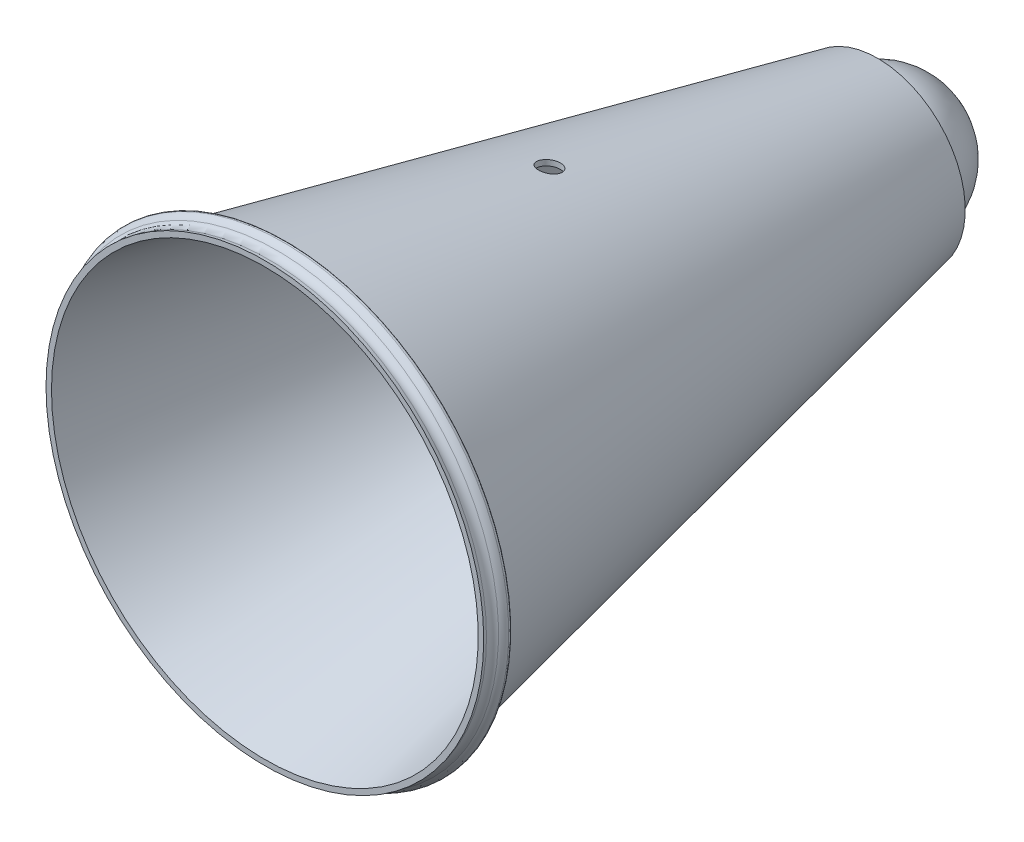
ISO-10303-21;
HEADER;
FILE_DESCRIPTION(('STEP AP214'),'2;1');
FILE_NAME('part.step','',(''),(''),'','','');
FILE_SCHEMA(('AUTOMOTIVE_DESIGN { 1 0 10303 214 1 1 1 1 }'));
ENDSEC;
DATA;
#1=APPLICATION_CONTEXT('core data for automotive mechanical design processes');
#2=APPLICATION_PROTOCOL_DEFINITION('international standard','automotive_design',2000,#1);
#3=PRODUCT_CONTEXT('',#1,'mechanical');
#4=PRODUCT('Part','Part','',(#3));
#5=PRODUCT_RELATED_PRODUCT_CATEGORY('part','',(#4));
#6=PRODUCT_DEFINITION_FORMATION('','',#4);
#7=PRODUCT_DEFINITION_CONTEXT('part definition',#1,'design');
#8=PRODUCT_DEFINITION('design','',#6,#7);
#9=PRODUCT_DEFINITION_SHAPE('','',#8);
#10=(LENGTH_UNIT() NAMED_UNIT(*) SI_UNIT(.MILLI.,.METRE.));
#11=(NAMED_UNIT(*) PLANE_ANGLE_UNIT() SI_UNIT($,.RADIAN.));
#12=(NAMED_UNIT(*) SI_UNIT($,.STERADIAN.) SOLID_ANGLE_UNIT());
#13=UNCERTAINTY_MEASURE_WITH_UNIT(LENGTH_MEASURE(1.E-05),#10,'distance_accuracy_value','');
#14=(GEOMETRIC_REPRESENTATION_CONTEXT(3) GLOBAL_UNCERTAINTY_ASSIGNED_CONTEXT((#13)) GLOBAL_UNIT_ASSIGNED_CONTEXT((#10,
#11,#12)) REPRESENTATION_CONTEXT('',''));
#15=CARTESIAN_POINT('',(0.,0.,0.));
#16=DIRECTION('',(0.,0.,1.));
#17=DIRECTION('',(1.,0.,0.));
#18=AXIS2_PLACEMENT_3D('',#15,#16,#17);
#19=CARTESIAN_POINT('',(0.,0.,176.773784800608));
#20=DIRECTION('',(0.,0.,1.));
#21=DIRECTION('',(1.,0.,0.));
#22=AXIS2_PLACEMENT_3D('',#19,#20,#21);
#23=CONICAL_SURFACE('',#22,63.2798883473292,0.211287481866079);
#24=CARTESIAN_POINT('',(0.,0.,177.8));
#25=DIRECTION('',(0.,0.,-1.));
#26=DIRECTION('',(-1.,0.,0.));
#27=AXIS2_PLACEMENT_3D('',#24,#25,#26);
#28=CIRCLE('',#27,63.5);
#29=CARTESIAN_POINT('',(-63.5,0.,177.8));
#30=VERTEX_POINT('',#29);
#31=EDGE_CURVE('E12',#30,#30,#28,.T.);
#32=ORIENTED_EDGE('',*,*,#31,.T.);
#33=EDGE_LOOP('',(#32));
#34=FACE_BOUND('',#33,.T.);
#35=CARTESIAN_POINT('',(0.,0.,176.773784800608));
#36=DIRECTION('',(0.,0.,-1.));
#37=DIRECTION('',(-1.,0.,0.));
#38=AXIS2_PLACEMENT_3D('',#35,#36,#37);
#39=CIRCLE('',#38,63.2798883473292);
#40=CARTESIAN_POINT('',(-63.2798883473292,0.,176.773784800608));
#41=VERTEX_POINT('',#40);
#42=EDGE_CURVE('E116',#41,#41,#39,.T.);
#43=ORIENTED_EDGE('',*,*,#42,.F.);
#44=EDGE_LOOP('',(#43));
#45=FACE_BOUND('',#44,.T.);
#46=ADVANCED_FACE('F45',(#34,#45),#23,.T.);
#47=CARTESIAN_POINT('',(0.,63.5,177.8));
#48=DIRECTION('',(0.,0.,1.));
#49=DIRECTION('',(1.,0.,0.));
#50=AXIS2_PLACEMENT_3D('',#47,#48,#49);
#51=PLANE('',#50);
#52=CARTESIAN_POINT('',(0.,0.,177.8));
#53=DIRECTION('',(0.,0.,-1.));
#54=DIRECTION('',(-1.,0.,0.));
#55=AXIS2_PLACEMENT_3D('',#52,#53,#54);
#56=CIRCLE('',#55,61.9125);
#57=CARTESIAN_POINT('',(-61.9125,0.,177.8));
#58=VERTEX_POINT('',#57);
#59=EDGE_CURVE('E56',#58,#58,#56,.T.);
#60=ORIENTED_EDGE('',*,*,#59,.T.);
#61=EDGE_LOOP('',(#60));
#62=FACE_BOUND('',#61,.T.);
#63=ORIENTED_EDGE('',*,*,#31,.F.);
#64=EDGE_LOOP('',(#63));
#65=FACE_BOUND('',#64,.T.);
#66=ADVANCED_FACE('F99',(#62,#65),#51,.T.);
#67=CARTESIAN_POINT('',(0.,0.,177.8));
#68=DIRECTION('',(0.,0.,1.));
#69=DIRECTION('',(1.,0.,0.));
#70=AXIS2_PLACEMENT_3D('',#67,#68,#69);
#71=CONICAL_SURFACE('',#70,61.9125,0.211287481866075);
#72=CARTESIAN_POINT('',(-1.75592457635452,-43.6037327022687,92.6047488054715));
#73=CARTESIAN_POINT('',(-1.90469871790617,-43.618942643446,92.703515718948));
#74=CARTESIAN_POINT('',(-2.0450706855046,-43.63642738404,92.8148331172774));
#75=CARTESIAN_POINT('',(-2.30493126711449,-43.6759525180203,93.0591553004506));
#76=CARTESIAN_POINT('',(-2.42439333180131,-43.6979986266265,93.1921872482258));
#77=CARTESIAN_POINT('',(-2.6389524784077,-43.7464890116741,93.4757076816206));
#78=CARTESIAN_POINT('',(-2.73407474914574,-43.7729286941477,93.6261778844019));
#79=CARTESIAN_POINT('',(-2.89765102820914,-43.829905872626,93.9401955603251));
#80=CARTESIAN_POINT('',(-2.96611100636758,-43.8604424492525,94.1037400961565));
#81=CARTESIAN_POINT('',(-3.07541029725886,-43.9254595149883,94.4411322571888));
#82=CARTESIAN_POINT('',(-3.11593521226483,-43.9599799488675,94.6150739527986));
#83=CARTESIAN_POINT('',(-3.16732557969221,-44.0319228666889,94.9667028589519));
#84=CARTESIAN_POINT('',(-3.17818674749977,-44.0693457690593,95.1443906068383));
#85=CARTESIAN_POINT('',(-3.17012457834671,-44.1468456021324,95.5020839002096));
#86=CARTESIAN_POINT('',(-3.15062557938201,-44.1869596863644,95.6820684750732));
#87=CARTESIAN_POINT('',(-3.08145742533036,-44.2679306526475,96.0359797276608));
#88=CARTESIAN_POINT('',(-3.03178506817437,-44.308787613088,96.2099057603662));
#89=CARTESIAN_POINT('',(-2.90274042438112,-44.3903767866832,96.5492784155506));
#90=CARTESIAN_POINT('',(-2.82297190736385,-44.4310996809037,96.7145768497478));
#91=CARTESIAN_POINT('',(-2.63588286272743,-44.5102353642646,97.0294028972641));
#92=CARTESIAN_POINT('',(-2.52856197753421,-44.5486481234162,97.1789303058717));
#93=CARTESIAN_POINT('',(-2.28976088448941,-44.6212880654127,97.4570418600024));
#94=CARTESIAN_POINT('',(-2.15841063230104,-44.6555361878893,97.5857319597931));
#95=CARTESIAN_POINT('',(-1.87466100507538,-44.7184332477577,97.8190446072581));
#96=CARTESIAN_POINT('',(-1.72226493847309,-44.7470830635058,97.9236709309187));
#97=CARTESIAN_POINT('',(-1.40521615654297,-44.7965749707404,98.1027554264389));
#98=CARTESIAN_POINT('',(-1.24102304865543,-44.8176123032594,98.1779726987926));
#99=CARTESIAN_POINT('',(-0.901538110208999,-44.8518278416355,98.2996465338151));
#100=CARTESIAN_POINT('',(-0.726248914723673,-44.865007905731,98.3461098968626));
#101=CARTESIAN_POINT('',(-0.376103182959759,-44.8824483618564,98.4074777661068));
#102=CARTESIAN_POINT('',(-0.201443062129339,-44.8870026452663,98.423422299012));
#103=CARTESIAN_POINT('',(0.148128838808943,-44.8878386820878,98.4263538856944));
#104=CARTESIAN_POINT('',(0.323040585305546,-44.8841214533654,98.4133445024483));
#105=CARTESIAN_POINT('',(0.665079505219132,-44.8687537446819,98.3593046177744));
#106=CARTESIAN_POINT('',(0.832288077690785,-44.8572375305151,98.3187483240212));
#107=CARTESIAN_POINT('',(1.1573926666548,-44.8270122811468,98.2114814009582));
#108=CARTESIAN_POINT('',(1.31528828378557,-44.8083029377453,98.1447696509772));
#109=CARTESIAN_POINT('',(1.61958740756018,-44.7643328083911,97.9863056950448));
#110=CARTESIAN_POINT('',(1.7658167668254,-44.7389907689917,97.8942421325641));
#111=CARTESIAN_POINT('',(2.04083533293718,-44.6830648698111,97.6882670701159));
#112=CARTESIAN_POINT('',(2.16962183976917,-44.6524802001688,97.5743521943183));
#113=CARTESIAN_POINT('',(2.41059888755116,-44.5863209117797,97.3238416450625));
#114=CARTESIAN_POINT('',(2.52210945930601,-44.5506158768589,97.1866263787883));
#115=CARTESIAN_POINT('',(2.72062871371417,-44.4765113750652,96.8961374221889));
#116=CARTESIAN_POINT('',(2.80763318734233,-44.4381114467459,96.7428609794842));
#117=CARTESIAN_POINT('',(2.95734451169197,-44.3588687606104,96.4193863667336));
#118=CARTESIAN_POINT('',(3.01921942315681,-44.3179871886958,96.2488121504336));
#119=CARTESIAN_POINT('',(3.11309619161876,-44.2364015087603,95.899582584397));
#120=CARTESIAN_POINT('',(3.14509547547227,-44.1956974163259,95.7209265399735));
#121=CARTESIAN_POINT('',(3.17842689280496,-44.1153448893929,95.3583566393991));
#122=CARTESIAN_POINT('',(3.17940345714304,-44.0757138934701,95.1744059948341));
#123=CARTESIAN_POINT('',(3.14950966888291,-43.9991826181157,94.8085266557163));
#124=CARTESIAN_POINT('',(3.11864064407311,-43.9622822249016,94.6265978771824));
#125=CARTESIAN_POINT('',(3.02608977657202,-43.8924911659186,94.2719055369243));
#126=CARTESIAN_POINT('',(2.96471170907214,-43.859564869617,94.0990698346325));
#127=CARTESIAN_POINT('',(2.81276363785658,-43.7979670661818,93.7659199912302));
#128=CARTESIAN_POINT('',(2.72219661437406,-43.7692951251088,93.6056045738563));
#129=CARTESIAN_POINT('',(2.51629907658438,-43.7171188442209,93.3054296723339));
#130=CARTESIAN_POINT('',(2.40147742808972,-43.693525853183,93.1652365227348));
#131=CARTESIAN_POINT('',(2.14924860776342,-43.6510007575356,92.9060624771804));
#132=CARTESIAN_POINT('',(2.01184345687075,-43.632068236251,92.7870796851496));
#133=CARTESIAN_POINT('',(1.72078771647148,-43.5991558677491,92.5758031206844));
#134=CARTESIAN_POINT('',(1.56743823858328,-43.5851003631751,92.4831061457404));
#135=CARTESIAN_POINT('',(1.24707134511875,-43.561452665384,92.3247030805436));
#136=CARTESIAN_POINT('',(1.08005518348057,-43.5518600632278,92.2589945173871));
#137=CARTESIAN_POINT('',(0.73875875113641,-43.5371123003969,92.1570578744312));
#138=CARTESIAN_POINT('',(0.564559736962561,-43.5319170075058,92.1205633417278));
#139=CARTESIAN_POINT('',(0.212394538346338,-43.5257471905153,92.0771480221921));
#140=CARTESIAN_POINT('',(0.0344275315392171,-43.5247735975464,92.0702337595348));
#141=CARTESIAN_POINT('',(-0.319592025038126,-43.5270309837,92.0861725117156));
#142=CARTESIAN_POINT('',(-0.495648689932206,-43.5302494886513,92.1089372128526));
#143=CARTESIAN_POINT('',(-0.841249891619732,-43.5409128384184,92.1833899292151));
#144=CARTESIAN_POINT('',(-1.01080200591246,-43.5483525955414,92.2350431253157));
#145=CARTESIAN_POINT('',(-1.27658858024015,-43.5638949884276,92.3408744096267));
#146=CARTESIAN_POINT('',(-1.37630630312179,-43.5706835151953,92.386714244029));
#147=CARTESIAN_POINT('',(-1.57037655679402,-43.5859406838346,92.4883804124937));
#148=CARTESIAN_POINT('',(-1.66472909851316,-43.5944093222838,92.5442067262133));
#149=CARTESIAN_POINT('',(-1.75592457635452,-43.6037327022687,92.6047488054715));
#150=B_SPLINE_CURVE_WITH_KNOTS('',3,(#72,#73,#74,#75,#76,#77,#78,#79,#80,#81,#82,#83,#84,#85,
#86,#87,#88,#89,#90,#91,#92,#93,#94,#95,#96,#97,#98,#99,#100,#101,#102,#103,#104,#105,#106,#107,
#108,#109,#110,#111,#112,#113,#114,#115,#116,#117,#118,#119,#120,#121,#122,#123,#124,#125,#126,
#127,#128,#129,#130,#131,#132,#133,#134,#135,#136,#137,#138,#139,#140,#141,#142,#143,#144,#145,
#146,#147,#148,#149),.UNSPECIFIED.,.T.,.F.,(4,2,2,2,2,2,2,2,2,2,2,2,2,2,2,2,2,2,2,2,2,2,2,2,2,2,
2,2,2,2,2,2,2,2,2,2,2,2,4),(0.,0.53725485007839,1.07518698138688,1.61256014403831,
2.14981291663118,2.69301764176665,3.23630082291809,3.79001136520331,4.34378067884562,
4.90511053437975,5.46644767520964,6.02483421789179,6.58313308104417,7.12588176118344,
7.66850203065962,8.19227651479957,8.71598654848434,9.23090228159759,9.74584007948756,
10.2674081248609,10.7890568127659,11.3277544668677,11.8665445882109,12.4219482746511,
12.9773997927774,13.5392153892769,14.1010075620587,14.6573148267201,15.2135653096174,
15.7591353861429,16.3046566675749,16.8412911169838,17.3778763844889,17.9095099960524,
18.4412608577931,18.9714330298749,19.5009675615747,19.8302943657395,20.1596204990614),.UNSPECIFIED.);
#151=CARTESIAN_POINT('',(-1.75592457635452,-43.6037327022687,92.6047488054715));
#152=VERTEX_POINT('',#151);
#153=EDGE_CURVE('E90',#152,#152,#150,.T.);
#154=ORIENTED_EDGE('',*,*,#153,.F.);
#155=EDGE_LOOP('',(#154));
#156=FACE_BOUND('',#155,.T.);
#157=CARTESIAN_POINT('',(-1.75592457635452,43.6037327022687,92.6047488054715));
#158=CARTESIAN_POINT('',(-1.60900565993722,43.5887150768251,92.5072326732046));
#159=CARTESIAN_POINT('',(-1.45368962295687,43.5758939534862,92.4218172644629));
#160=CARTESIAN_POINT('',(-1.13064727533637,43.5545860047746,92.2778635291146));
#161=CARTESIAN_POINT('',(-0.9629078985348,43.5461038191369,92.2193539803434));
#162=CARTESIAN_POINT('',(-0.619911211579555,43.5334001892956,92.1310782563849));
#163=CARTESIAN_POINT('',(-0.444656167509118,43.5291774700872,92.1013034800064));
#164=CARTESIAN_POINT('',(-0.0916259811188395,43.5249341944062,92.0713825988535));
#165=CARTESIAN_POINT('',(0.0861486022218099,43.5249127200102,92.0712300219706));
#166=CARTESIAN_POINT('',(0.438851079287008,43.5290647765628,92.100509912786));
#167=CARTESIAN_POINT('',(0.613783768951078,43.5332302809945,92.1298857739192));
#168=CARTESIAN_POINT('',(0.956193457466696,43.5458001964896,92.2172554182934));
#169=CARTESIAN_POINT('',(1.12367027904929,43.5542047082801,92.2752498815679));
#170=CARTESIAN_POINT('',(1.446555101029,43.5753479098601,92.4181640723479));
#171=CARTESIAN_POINT('',(1.60195453204081,43.5880896432084,92.5031027045299));
#172=CARTESIAN_POINT('',(1.89621744965366,43.6179820282771,92.6973413908198));
#173=CARTESIAN_POINT('',(2.03508081063582,43.6351327134876,92.8066416299764));
#174=CARTESIAN_POINT('',(2.29310299727766,43.6739462420565,93.0469268745887));
#175=CARTESIAN_POINT('',(2.41216333819444,43.6956304939647,93.1780141384834));
#176=CARTESIAN_POINT('',(2.62659333879266,43.7433434252176,93.4576060729127));
#177=CARTESIAN_POINT('',(2.72196203913397,43.7693722804158,93.6061114483965));
#178=CARTESIAN_POINT('',(2.88751471471514,43.8257934336874,93.9179392476778));
#179=CARTESIAN_POINT('',(2.95741003527773,43.8562305916852,94.0814067250291));
#180=CARTESIAN_POINT('',(3.06888964041023,43.9207365740061,94.4170408223656));
#181=CARTESIAN_POINT('',(3.11047138034463,43.9548057244302,94.5892082227485));
#182=CARTESIAN_POINT('',(3.16496521403195,44.0264657165266,94.9405314610872));
#183=CARTESIAN_POINT('',(3.17736048490373,44.0641079371107,95.1197569450784));
#184=CARTESIAN_POINT('',(3.17189750028498,44.1413916808492,95.4773153987624));
#185=CARTESIAN_POINT('',(3.15403574945052,44.18103343448,95.6556482629512));
#186=CARTESIAN_POINT('',(3.08809411343791,44.2618434503543,96.009823847782));
#187=CARTESIAN_POINT('',(3.03946951208801,44.3030263659727,96.1855619754563));
#188=CARTESIAN_POINT('',(2.9128578841986,44.3847705737862,96.5262921264621));
#189=CARTESIAN_POINT('',(2.83486858660891,44.425331817649,96.6912833174733));
#190=CARTESIAN_POINT('',(2.6509689888794,44.5044918164683,97.0068547785325));
#191=CARTESIAN_POINT('',(2.54489160730178,44.5430771214472,97.1573412064298));
#192=CARTESIAN_POINT('',(2.30776985353082,44.6163309692395,97.4382877742788));
#193=CARTESIAN_POINT('',(2.17672709633022,44.6509997651782,97.5687492086481));
#194=CARTESIAN_POINT('',(1.89554700124628,44.7142142469676,97.8035288216856));
#195=CARTESIAN_POINT('',(1.74576508693647,44.7428525194606,97.9082472060711));
#196=CARTESIAN_POINT('',(1.42958162459567,44.7932475618335,98.0908139201876));
#197=CARTESIAN_POINT('',(1.26318374104204,44.8150058446319,98.1686681577226));
#198=CARTESIAN_POINT('',(0.924584412624153,44.8498255998206,98.2925573281535));
#199=CARTESIAN_POINT('',(0.75277523654119,44.863158701774,98.3395881261306));
#200=CARTESIAN_POINT('',(0.403292541896284,44.8815386214235,98.404289459004));
#201=CARTESIAN_POINT('',(0.225620204505798,44.8865870978399,98.4219658711466));
#202=CARTESIAN_POINT('',(-0.125039853282844,44.8880914364687,98.4272395531366));
#203=CARTESIAN_POINT('',(-0.298014309606413,44.8847917883181,98.4156926755766));
#204=CARTESIAN_POINT('',(-0.639453967936915,44.8702931963049,98.3647255611985));
#205=CARTESIAN_POINT('',(-0.807919355102415,44.8590945773205,98.3253064707417));
#206=CARTESIAN_POINT('',(-1.13518685669645,44.8294306240614,98.2200916500382));
#207=CARTESIAN_POINT('',(-1.29401418082164,44.8109852822299,98.1543684789041));
#208=CARTESIAN_POINT('',(-1.59834151634242,44.7677455740217,97.9986642048057));
#209=CARTESIAN_POINT('',(-1.74384012775739,44.7429505417413,97.9086805575488));
#210=CARTESIAN_POINT('',(-2.02129576334143,44.6874820456664,97.7046617158387));
#211=CARTESIAN_POINT('',(-2.15283126357892,44.6566788984553,97.5900889751867));
#212=CARTESIAN_POINT('',(-2.39496117586382,44.5909795108759,97.3416244556081));
#213=CARTESIAN_POINT('',(-2.50555185698742,44.5560825430604,97.2077292422185));
#214=CARTESIAN_POINT('',(-2.70665054639517,44.4823526144809,96.9193193446654));
#215=CARTESIAN_POINT('',(-2.79633075354037,44.4434252156905,96.7642512973969));
#216=CARTESIAN_POINT('',(-2.94833121890883,44.3642328644771,96.4415496607734));
#217=CARTESIAN_POINT('',(-3.01064755517098,44.3239677212092,96.2739142742172));
#218=CARTESIAN_POINT('',(-3.10742570311481,44.2426084770173,95.9265844891005));
#219=CARTESIAN_POINT('',(-3.14121394084486,44.2015166088139,95.746701418817));
#220=CARTESIAN_POINT('',(-3.17743919273417,44.1208181977782,95.3834752054006));
#221=CARTESIAN_POINT('',(-3.17987659718831,44.081211636461,95.2001321053712));
#222=CARTESIAN_POINT('',(-3.15309337960616,44.0046440128213,94.8351192783039));
#223=CARTESIAN_POINT('',(-3.1238598275637,43.9676840375657,94.653450265278));
#224=CARTESIAN_POINT('',(-3.03422190168719,43.8973637599947,94.2971855383256));
#225=CARTESIAN_POINT('',(-2.97381265894007,43.8640040209363,94.1225909338509));
#226=CARTESIAN_POINT('',(-2.82447840310173,43.8020683150854,93.7885234877905));
#227=CARTESIAN_POINT('',(-2.73601388122505,43.7734257236843,93.6288569358216));
#228=CARTESIAN_POINT('',(-2.5326830216427,43.7207337463471,93.326663820239));
#229=CARTESIAN_POINT('',(-2.41785050379422,43.6966785483051,93.1841156540689));
#230=CARTESIAN_POINT('',(-2.21096138768445,43.6611933787941,92.9683644041252));
#231=CARTESIAN_POINT('',(-2.12572251008611,43.648346515633,92.8887466155078));
#232=CARTESIAN_POINT('',(-1.94685841616751,43.6245895004469,92.7392327975916));
#233=CARTESIAN_POINT('',(-1.85323332275233,43.6136793200454,92.6693366258548));
#234=CARTESIAN_POINT('',(-1.75592457635452,43.6037327022687,92.6047488054715));
#235=B_SPLINE_CURVE_WITH_KNOTS('',3,(#157,#158,#159,#160,#161,#162,#163,#164,#165,#166,#167,
#168,#169,#170,#171,#172,#173,#174,#175,#176,#177,#178,#179,#180,#181,#182,#183,#184,#185,#186,
#187,#188,#189,#190,#191,#192,#193,#194,#195,#196,#197,#198,#199,#200,#201,#202,#203,#204,#205,
#206,#207,#208,#209,#210,#211,#212,#213,#214,#215,#216,#217,#218,#219,#220,#221,#222,#223,#224,
#225,#226,#227,#228,#229,#230,#231,#232,#233,#234),.UNSPECIFIED.,.T.,.F.,(4,2,2,2,2,2,2,2,2,2,2,
2,2,2,2,2,2,2,2,2,2,2,2,2,2,2,2,2,2,2,2,2,2,2,2,2,2,2,4),(0.,0.53049961853436,1.06156533396453,
1.5924720359269,2.12326274077474,2.65303784684418,3.18282554200122,3.71298577415966,
4.24315003350746,4.77587680767805,5.30862514991569,5.84723534635678,6.385893943098,
6.9340214321411,7.48221224614646,8.04039241873618,8.59861576955707,9.16023735543006,
9.72182262272305,10.2740294743949,10.8261148104927,11.3593457825845,11.8924699799088,
12.4101625056598,12.927833740381,13.4440867276781,13.9603938775554,14.489410935644,
15.0185221396769,15.5659510050501,16.1134583057628,16.6735574642852,17.2336496499773,
17.7939705854844,18.354379056499,18.906027754519,19.4569728159619,19.8083435621241,
20.1597091595769),.UNSPECIFIED.);
#236=CARTESIAN_POINT('',(-1.75592457635452,43.6037327022687,92.6047488054715));
#237=VERTEX_POINT('',#236);
#238=EDGE_CURVE('E85',#237,#237,#235,.T.);
#239=ORIENTED_EDGE('',*,*,#238,.F.);
#240=EDGE_LOOP('',(#239));
#241=FACE_BOUND('',#240,.T.);
#242=CARTESIAN_POINT('',(0.,0.,12.7));
#243=DIRECTION('',(0.,0.,-1.));
#244=DIRECTION('',(-1.,0.,0.));
#245=AXIS2_PLACEMENT_3D('',#242,#243,#244);
#246=CIRCLE('',#245,26.5004013705139);
#247=CARTESIAN_POINT('',(-26.5004013705139,0.,12.7));
#248=VERTEX_POINT('',#247);
#249=EDGE_CURVE('E61',#248,#248,#246,.T.);
#250=ORIENTED_EDGE('',*,*,#249,.T.);
#251=EDGE_LOOP('',(#250));
#252=FACE_BOUND('',#251,.T.);
#253=ORIENTED_EDGE('',*,*,#59,.F.);
#254=EDGE_LOOP('',(#253));
#255=FACE_BOUND('',#254,.T.);
#256=ADVANCED_FACE('F94',(#156,#241,#252,#255),#71,.F.);
#257=CARTESIAN_POINT('',(0.,19.05,12.7));
#258=DIRECTION('',(0.,0.,1.));
#259=DIRECTION('',(1.,0.,0.));
#260=AXIS2_PLACEMENT_3D('',#257,#258,#259);
#261=PLANE('',#260);
#262=CARTESIAN_POINT('',(0.,0.,12.7));
#263=DIRECTION('',(0.,0.,-1.));
#264=DIRECTION('',(-1.,0.,0.));
#265=AXIS2_PLACEMENT_3D('',#262,#263,#264);
#266=CIRCLE('',#265,19.05);
#267=CARTESIAN_POINT('',(-19.05,0.,12.7));
#268=VERTEX_POINT('',#267);
#269=EDGE_CURVE('E144',#268,#268,#266,.T.);
#270=ORIENTED_EDGE('',*,*,#269,.T.);
#271=EDGE_LOOP('',(#270));
#272=FACE_BOUND('',#271,.T.);
#273=ORIENTED_EDGE('',*,*,#249,.F.);
#274=EDGE_LOOP('',(#273));
#275=FACE_BOUND('',#274,.T.);
#276=ADVANCED_FACE('F98',(#272,#275),#261,.T.);
#277=CARTESIAN_POINT('',(0.,0.,0.));
#278=DIRECTION('',(0.,0.,-1.));
#279=DIRECTION('',(-1.,0.,0.));
#280=AXIS2_PLACEMENT_3D('',#277,#278,#279);
#281=CYLINDRICAL_SURFACE('',#280,19.05);
#282=CARTESIAN_POINT('',(0.,0.,0.));
#283=DIRECTION('',(0.,0.,-1.));
#284=DIRECTION('',(-1.,0.,0.));
#285=AXIS2_PLACEMENT_3D('',#282,#283,#284);
#286=CIRCLE('',#285,19.05);
#287=CARTESIAN_POINT('',(-19.05,0.,0.));
#288=VERTEX_POINT('',#287);
#289=EDGE_CURVE('E141',#288,#288,#286,.T.);
#290=ORIENTED_EDGE('',*,*,#289,.T.);
#291=EDGE_LOOP('',(#290));
#292=FACE_BOUND('',#291,.T.);
#293=ORIENTED_EDGE('',*,*,#269,.F.);
#294=EDGE_LOOP('',(#293));
#295=FACE_BOUND('',#294,.T.);
#296=ADVANCED_FACE('F151',(#292,#295),#281,.F.);
#297=CARTESIAN_POINT('',(0.,0.,0.));
#298=DIRECTION('',(0.,0.,-1.));
#299=DIRECTION('',(0.,1.,0.));
#300=AXIS2_PLACEMENT_3D('',#297,#298,#299);
#301=SPHERICAL_SURFACE('',#300,19.05);
#302=ORIENTED_EDGE('',*,*,#289,.F.);
#303=EDGE_LOOP('',(#302));
#304=FACE_BOUND('',#303,.T.);
#305=ADVANCED_FACE('F156',(#304),#301,.F.);
#306=CARTESIAN_POINT('',(0.,0.,0.));
#307=DIRECTION('',(0.,0.,-1.));
#308=DIRECTION('',(0.,-1.,0.));
#309=AXIS2_PLACEMENT_3D('',#306,#307,#308);
#310=SPHERICAL_SURFACE('',#309,20.6375);
#311=CARTESIAN_POINT('',(0.,0.,0.));
#312=DIRECTION('',(0.,0.,-1.));
#313=DIRECTION('',(-1.,0.,0.));
#314=AXIS2_PLACEMENT_3D('',#311,#312,#313);
#315=CIRCLE('',#314,20.6375);
#316=CARTESIAN_POINT('',(-20.6375,0.,0.));
#317=VERTEX_POINT('',#316);
#318=EDGE_CURVE('E138',#317,#317,#315,.T.);
#319=ORIENTED_EDGE('',*,*,#318,.T.);
#320=EDGE_LOOP('',(#319));
#321=FACE_BOUND('',#320,.T.);
#322=ADVANCED_FACE('F163',(#321),#310,.T.);
#323=CARTESIAN_POINT('',(0.,25.4,0.));
#324=DIRECTION('',(0.,0.,-1.));
#325=DIRECTION('',(-1.,0.,0.));
#326=AXIS2_PLACEMENT_3D('',#323,#324,#325);
#327=PLANE('',#326);
#328=CARTESIAN_POINT('',(0.,0.,0.));
#329=DIRECTION('',(0.,0.,-1.));
#330=DIRECTION('',(-1.,0.,0.));
#331=AXIS2_PLACEMENT_3D('',#328,#329,#330);
#332=CIRCLE('',#331,25.4);
#333=CARTESIAN_POINT('',(-25.4,0.,0.));
#334=VERTEX_POINT('',#333);
#335=EDGE_CURVE('E135',#334,#334,#332,.T.);
#336=ORIENTED_EDGE('',*,*,#335,.T.);
#337=EDGE_LOOP('',(#336));
#338=FACE_BOUND('',#337,.T.);
#339=ORIENTED_EDGE('',*,*,#318,.F.);
#340=EDGE_LOOP('',(#339));
#341=FACE_BOUND('',#340,.T.);
#342=ADVANCED_FACE('F168',(#338,#341),#327,.T.);
#343=CARTESIAN_POINT('',(0.,0.,0.));
#344=DIRECTION('',(0.,0.,1.));
#345=DIRECTION('',(1.,0.,0.));
#346=AXIS2_PLACEMENT_3D('',#343,#344,#345);
#347=CONICAL_SURFACE('',#346,25.4,0.211287481866075);
#348=CARTESIAN_POINT('',(-1.62793079638061,-46.3861718802195,97.9758881712564));
#349=CARTESIAN_POINT('',(-1.78297319823986,-46.3608554285298,97.8832849688877));
#350=CARTESIAN_POINT('',(-1.92983008371927,-46.3322245816675,97.7775784758824));
#351=CARTESIAN_POINT('',(-2.20305853413738,-46.2697518664681,97.5433894681576));
#352=CARTESIAN_POINT('',(-2.32939705767423,-46.2359017609268,97.4148709013413));
#353=CARTESIAN_POINT('',(-2.55800927898897,-46.1646056299413,97.139233124628));
#354=CARTESIAN_POINT('',(-2.6603248714695,-46.1271660274686,96.992146995076));
#355=CARTESIAN_POINT('',(-2.83863079644906,-46.0501853308993,96.6833823401164));
#356=CARTESIAN_POINT('',(-2.91462817644333,-46.0106448026654,96.5217077358533));
#357=CARTESIAN_POINT('',(-3.03974733781353,-45.9300932510055,96.1846297907413));
#358=CARTESIAN_POINT('',(-3.08828547248385,-45.8890687031732,96.0090127749687));
#359=CARTESIAN_POINT('',(-3.15469609195765,-45.8077701616095,95.651883941763));
#360=CARTESIAN_POINT('',(-3.17256517794328,-45.7674962515546,95.4703714732526));
#361=CARTESIAN_POINT('',(-3.17698364335637,-45.6887044463728,95.1053324955168));
#362=CARTESIAN_POINT('',(-3.16332880478546,-45.650199658603,94.9218005626706));
#363=CARTESIAN_POINT('',(-3.10438349323442,-45.5763003816597,94.5592379315394));
#364=CARTESIAN_POINT('',(-3.05909497496575,-45.5409057004583,94.3802069558391));
#365=CARTESIAN_POINT('',(-2.93865793949454,-45.4744771856309,94.0342558331322));
#366=CARTESIAN_POINT('',(-2.86389618560749,-45.4433936516224,93.8672106967765));
#367=CARTESIAN_POINT('',(-2.68639877514083,-45.385616470616,93.5478702036438));
#368=CARTESIAN_POINT('',(-2.58366612892341,-45.3589223517036,93.3955732619849));
#369=CARTESIAN_POINT('',(-2.35527231026653,-45.3107145151,93.1132615781249));
#370=CARTESIAN_POINT('',(-2.23008994685969,-45.2891110644755,92.9828747264211));
#371=CARTESIAN_POINT('',(-1.95902109194796,-45.2505607625947,92.7449298976699));
#372=CARTESIAN_POINT('',(-1.81313631482767,-45.2336135260943,92.6373700321389));
#373=CARTESIAN_POINT('',(-1.50718773231155,-45.2045940763802,92.4498713891265));
#374=CARTESIAN_POINT('',(-1.34736964038456,-45.1924525029522,92.369542228179));
#375=CARTESIAN_POINT('',(-1.01628582869599,-45.1726224856716,92.236763444498));
#376=CARTESIAN_POINT('',(-0.845020664370506,-45.164933825929,92.18431247016));
#377=CARTESIAN_POINT('',(-0.497379207518029,-45.1539829887482,92.1092018441647));
#378=CARTESIAN_POINT('',(-0.321054648971615,-45.1506859551382,92.0863076467476));
#379=CARTESIAN_POINT('',(0.0329704611687506,-45.1483668857725,92.0702305617048));
#380=CARTESIAN_POINT('',(0.210670982889489,-45.1493447574638,92.0770470308333));
#381=CARTESIAN_POINT('',(0.561905561881616,-45.155578662748,92.1201261669176));
#382=CARTESIAN_POINT('',(0.735449454776655,-45.1608232959903,92.1563103656916));
#383=CARTESIAN_POINT('',(1.07394516212269,-45.1756309079984,92.2569342490199));
#384=CARTESIAN_POINT('',(1.23889702966193,-45.1851938600787,92.3213737589677));
#385=CARTESIAN_POINT('',(1.55576762209415,-45.2087231077913,92.4766660928875));
#386=CARTESIAN_POINT('',(1.70767005650594,-45.2226948083795,92.5675513275941));
#387=CARTESIAN_POINT('',(1.99399518606454,-45.2550792340697,92.772974432524));
#388=CARTESIAN_POINT('',(2.12841764777562,-45.2734920184705,92.887512618567));
#389=CARTESIAN_POINT('',(2.37685872620694,-45.3148373557272,93.1375587988351));
#390=CARTESIAN_POINT('',(2.49075486154665,-45.3377954287491,93.2731842223998));
#391=CARTESIAN_POINT('',(2.69418480313757,-45.3879838846605,93.5609051575495));
#392=CARTESIAN_POINT('',(2.7837173997024,-45.4152144795814,93.7130014864158));
#393=CARTESIAN_POINT('',(2.93713209974138,-45.4739468552315,94.0312072374293));
#394=CARTESIAN_POINT('',(3.00068824043703,-45.5054966526434,94.1974648705143));
#395=CARTESIAN_POINT('',(3.09910889739512,-45.5720252408682,94.5376059866666));
#396=CARTESIAN_POINT('',(3.13397068907407,-45.6070043569487,94.7114901922409));
#397=CARTESIAN_POINT('',(3.17470923810657,-45.6802533401318,95.0652755680103));
#398=CARTESIAN_POINT('',(3.18004824548905,-45.718571423972,95.2452286629098));
#399=CARTESIAN_POINT('',(3.1603904397876,-45.7968778780391,95.6031063489663));
#400=CARTESIAN_POINT('',(3.13539020668938,-45.8368664360807,95.7810307091504));
#401=CARTESIAN_POINT('',(3.05515807285075,-45.9179556098306,96.1330489550518));
#402=CARTESIAN_POINT('',(2.99941537163182,-45.9590635386114,96.3070249245925));
#403=CARTESIAN_POINT('',(2.85886434287593,-46.0402408319246,96.6430891109231));
#404=CARTESIAN_POINT('',(2.77405414042157,-46.0803101292834,96.8051765600585));
#405=CARTESIAN_POINT('',(2.57721527428497,-46.1579436815275,97.11336347707));
#406=CARTESIAN_POINT('',(2.46509860709213,-46.1954993262202,97.2594089911544));
#407=CARTESIAN_POINT('',(2.21669257470908,-46.2662970851432,97.5305014195339));
#408=CARTESIAN_POINT('',(2.08040528079432,-46.2995395685627,97.6555501313409));
#409=CARTESIAN_POINT('',(1.79020816478927,-46.3594969740916,97.8784209140762));
#410=CARTESIAN_POINT('',(1.63669330675271,-46.3863264294781,97.9767258688963));
#411=CARTESIAN_POINT('',(1.31426322198283,-46.4328885280478,98.1459385863976));
#412=CARTESIAN_POINT('',(1.14535208694603,-46.452623049919,98.2168536021102));
#413=CARTESIAN_POINT('',(0.80318382453013,-46.4833621667534,98.3267998457509));
#414=CARTESIAN_POINT('',(0.630277907191717,-46.4946445596121,98.366847040305));
#415=CARTESIAN_POINT('',(0.279836835780273,-46.5089582439664,98.4175933605832));
#416=CARTESIAN_POINT('',(0.102301342911996,-46.5119889298764,98.4282903323206));
#417=CARTESIAN_POINT('',(-0.247420500212483,-46.5096601800374,98.420052749393));
#418=CARTESIAN_POINT('',(-0.419627096731741,-46.504514295126,98.4018723999479));
#419=CARTESIAN_POINT('',(-0.758262742188664,-46.4865064577766,98.337925325718));
#420=CARTESIAN_POINT('',(-0.924698699386451,-46.4736540940113,98.2921928818851));
#421=CARTESIAN_POINT('',(-1.18031718686615,-46.4477231256944,98.1991692242919));
#422=CARTESIAN_POINT('',(-1.2729285340982,-46.4369459864269,98.1603796843887));
#423=CARTESIAN_POINT('',(-1.45383887936108,-46.4131747591942,98.0743600196368));
#424=CARTESIAN_POINT('',(-1.54213802662429,-46.4001807480183,98.0271301871453));
#425=CARTESIAN_POINT('',(-1.62793079638061,-46.3861718802195,97.9758881712564));
#426=B_SPLINE_CURVE_WITH_KNOTS('',3,(#348,#349,#350,#351,#352,#353,#354,#355,#356,#357,#358,
#359,#360,#361,#362,#363,#364,#365,#366,#367,#368,#369,#370,#371,#372,#373,#374,#375,#376,#377,
#378,#379,#380,#381,#382,#383,#384,#385,#386,#387,#388,#389,#390,#391,#392,#393,#394,#395,#396,
#397,#398,#399,#400,#401,#402,#403,#404,#405,#406,#407,#408,#409,#410,#411,#412,#413,#414,#415,
#416,#417,#418,#419,#420,#421,#422,#423,#424,#425),.UNSPECIFIED.,.T.,.F.,(4,2,2,2,2,2,2,2,2,2,2,
2,2,2,2,2,2,2,2,2,2,2,2,2,2,2,2,2,2,2,2,2,2,2,2,2,2,2,4),(0.,0.546691539762913,1.09425488837079,
1.64085610287341,2.18731083502783,2.74498171816903,3.30271439975117,3.86407030983209,
4.42539153562122,4.97957969656373,5.5337082366672,6.07718287082888,6.62061252562587,
7.15588476253316,7.69113104573105,8.2221032702652,8.7530639991292,9.28261069641044,
9.81215412134987,10.3423492850422,10.8725515284816,11.4058197007247,11.939114345706,
12.4789094514417,13.0187558058476,13.5684037147958,14.1181135889844,14.6772450086058,
15.2364125002161,15.7974064984663,16.3583524461572,16.9083721400766,17.4582460852343,
17.9891415854988,18.5200760466676,19.0373702346205,19.5540221186203,19.856544558863,
20.1590565222753),.UNSPECIFIED.);
#427=CARTESIAN_POINT('',(-1.62793079638061,-46.3861718802195,97.9758881712564));
#428=VERTEX_POINT('',#427);
#429=EDGE_CURVE('E48',#428,#428,#426,.T.);
#430=ORIENTED_EDGE('',*,*,#429,.F.);
#431=EDGE_LOOP('',(#430));
#432=FACE_BOUND('',#431,.T.);
#433=CARTESIAN_POINT('',(-1.78260178583157,45.2314071144858,92.6226523120923));
#434=CARTESIAN_POINT('',(-1.93044411859936,45.24711397146,92.7229706762249));
#435=CARTESIAN_POINT('',(-2.06974335653646,45.2651139348145,92.8357627796759));
#436=CARTESIAN_POINT('',(-2.32721154923815,45.3056724638933,93.0828304815006));
#437=CARTESIAN_POINT('',(-2.44535340864649,45.3282367974087,93.21713321674));
#438=CARTESIAN_POINT('',(-2.65706884060424,45.3777285478709,93.5029478350354));
#439=CARTESIAN_POINT('',(-2.75066839742141,45.4046513010591,93.6544412718039));
#440=CARTESIAN_POINT('',(-2.91104831185832,45.4625254881196,93.9702389371246));
#441=CARTESIAN_POINT('',(-2.9778346883281,45.493476015795,94.1345402807406));
#442=CARTESIAN_POINT('',(-3.08368261671091,45.559237789553,94.4732356359685));
#443=CARTESIAN_POINT('',(-3.12241861295273,45.594089113179,94.6477235276971));
#444=CARTESIAN_POINT('',(-3.17014833362639,45.6665714375932,95.0001607372118));
#445=CARTESIAN_POINT('',(-3.17913773825731,45.7042028412935,95.1781105539648));
#446=CARTESIAN_POINT('',(-3.16725189626275,45.781978471189,95.5360153919968));
#447=CARTESIAN_POINT('',(-3.14580455338426,45.8221569069916,95.7159440478384));
#448=CARTESIAN_POINT('',(-3.0727395138825,45.9031047003904,96.0694390410128));
#449=CARTESIAN_POINT('',(-3.02111874098695,45.9438741178256,96.2430047277039));
#450=CARTESIAN_POINT('',(-2.8882514290693,46.0250972741352,96.581183170768));
#451=CARTESIAN_POINT('',(-2.80663599672523,46.0655403817558,96.7456537715987));
#452=CARTESIAN_POINT('',(-2.61599149304382,46.1439747133916,97.0585270810767));
#453=CARTESIAN_POINT('',(-2.50696228405528,46.1819659250941,97.2069297090375));
#454=CARTESIAN_POINT('',(-2.26508178927305,46.2536043183277,97.4823538535038));
#455=CARTESIAN_POINT('',(-2.13238692694795,46.2872776684613,97.609505741363));
#456=CARTESIAN_POINT('',(-1.84624285085624,46.3489502512272,97.8395350845212));
#457=CARTESIAN_POINT('',(-1.69279697994247,46.3769503959647,97.942416442334));
#458=CARTESIAN_POINT('',(-1.37407204910096,46.4251214730287,98.1178750294013));
#459=CARTESIAN_POINT('',(-1.20924872231285,46.4454909256399,98.1912250327638));
#460=CARTESIAN_POINT('',(-0.868865081381382,46.478391909701,98.3091035439006));
#461=CARTESIAN_POINT('',(-0.693307255627368,46.4909252501533,98.3536387037962));
#462=CARTESIAN_POINT('',(-0.342851957677705,46.5071663794626,98.4112564284347));
#463=CARTESIAN_POINT('',(-0.168134231643458,46.5111592200381,98.4253550147234));
#464=CARTESIAN_POINT('',(0.181225566713916,46.5109545610398,98.4246314906907));
#465=CARTESIAN_POINT('',(0.355867645450102,46.5067580087513,98.4098127253032));
#466=CARTESIAN_POINT('',(0.697279151872093,46.4905343837295,98.3522467569904));
#467=CARTESIAN_POINT('',(0.864128877904953,46.478630442051,98.3099386787456));
#468=CARTESIAN_POINT('',(1.1882318557821,46.4477250185596,98.199247241104));
#469=CARTESIAN_POINT('',(1.34548466284766,46.428723208079,98.1308626742295));
#470=CARTESIAN_POINT('',(1.64832168122352,46.3842486611385,97.9691041928386));
#471=CARTESIAN_POINT('',(1.79372003260058,46.3586921521227,97.8754058585904));
#472=CARTESIAN_POINT('',(2.06681738731196,46.3024241582606,97.6662953258683));
#473=CARTESIAN_POINT('',(2.19451366221076,46.2717118803607,97.5508797865519));
#474=CARTESIAN_POINT('',(2.43300101467833,46.2053793731148,97.2975266346835));
#475=CARTESIAN_POINT('',(2.54311027814288,46.1696323625761,97.1589804445048));
#476=CARTESIAN_POINT('',(2.73861414373845,46.0955096970976,96.8660567376494));
#477=CARTESIAN_POINT('',(2.82400458574901,46.0571336010313,96.7116765620637));
#478=CARTESIAN_POINT('',(2.97020136166655,45.9780153351087,96.3863428669272));
#479=CARTESIAN_POINT('',(3.03019005374533,45.9372367150068,96.2150302873347));
#480=CARTESIAN_POINT('',(3.12018547083612,45.8558854285748,95.8646471821507));
#481=CARTESIAN_POINT('',(3.15018970269633,45.8153127796499,95.6855760127383));
#482=CARTESIAN_POINT('',(3.17944317776015,45.7352523190119,95.3226083938861));
#483=CARTESIAN_POINT('',(3.17835174700262,45.6957812704601,95.1386805698321));
#484=CARTESIAN_POINT('',(3.14435538102648,45.6195577777376,94.773208408506));
#485=CARTESIAN_POINT('',(3.11145176735397,45.5828052207033,94.5916639725403));
#486=CARTESIAN_POINT('',(3.01494826706216,45.5132851675092,94.2380887788679));
#487=CARTESIAN_POINT('',(2.9516511820719,45.4804822706411,94.0659824474937));
#488=CARTESIAN_POINT('',(2.79602120543542,45.419106150032,93.7346172250265));
#489=CARTESIAN_POINT('',(2.70369123883312,45.3905325006233,93.5753570417228));
#490=CARTESIAN_POINT('',(2.49449161321645,45.3385282922232,93.2775335441051));
#491=CARTESIAN_POINT('',(2.37812192360422,45.3150102740433,93.1386342816783));
#492=CARTESIAN_POINT('',(2.12303823618059,45.2726345917305,92.8822969292197));
#493=CARTESIAN_POINT('',(1.98432623760014,45.2537765110001,92.7648569209794));
#494=CARTESIAN_POINT('',(1.69095642774118,45.2210315371234,92.5568416324835));
#495=CARTESIAN_POINT('',(1.53659515553416,45.2070686734227,92.4658599210196));
#496=CARTESIAN_POINT('',(1.21450698977532,45.1836470391718,92.3110345420158));
#497=CARTESIAN_POINT('',(1.04678134035104,45.1741878499323,92.2471883518506));
#498=CARTESIAN_POINT('',(0.704425739357448,45.1597670329593,92.1490606299295));
#499=CARTESIAN_POINT('',(0.529875517923745,45.1547639598998,92.1145068051634));
#500=CARTESIAN_POINT('',(0.177341022626244,45.1490502204613,92.0749983835618));
#501=CARTESIAN_POINT('',(-0.000643999675706757,45.1483405004384,92.0700503125332));
#502=CARTESIAN_POINT('',(-0.35434648934641,45.1512017031766,92.0898801332481));
#503=CARTESIAN_POINT('',(-0.530069243939501,45.1547594789563,92.114566728916));
#504=CARTESIAN_POINT('',(-0.874680648587463,45.1661724856592,92.1927619679632));
#505=CARTESIAN_POINT('',(-1.04357728882821,45.1740225261019,92.2462357987765));
#506=CARTESIAN_POINT('',(-1.30775362421921,45.1902564315043,92.3547650488817));
#507=CARTESIAN_POINT('',(-1.40662127607567,45.1973041576352,92.4014995344115));
#508=CARTESIAN_POINT('',(-1.59892102413786,45.2130854660888,92.5048240822402));
#509=CARTESIAN_POINT('',(-1.69235313375691,45.2218190442511,92.5614141202172));
#510=CARTESIAN_POINT('',(-1.78260178583157,45.2314071144858,92.6226523120923));
#511=B_SPLINE_CURVE_WITH_KNOTS('',3,(#433,#434,#435,#436,#437,#438,#439,#440,#441,#442,#443,
#444,#445,#446,#447,#448,#449,#450,#451,#452,#453,#454,#455,#456,#457,#458,#459,#460,#461,#462,
#463,#464,#465,#466,#467,#468,#469,#470,#471,#472,#473,#474,#475,#476,#477,#478,#479,#480,#481,
#482,#483,#484,#485,#486,#487,#488,#489,#490,#491,#492,#493,#494,#495,#496,#497,#498,#499,#500,
#501,#502,#503,#504,#505,#506,#507,#508,#509,#510),.UNSPECIFIED.,.T.,.F.,(4,2,2,2,2,2,2,2,2,2,2,
2,2,2,2,2,2,2,2,2,2,2,2,2,2,2,2,2,2,2,2,2,2,2,2,2,2,2,4),(0.,0.537656209576209,1.07599612395904,
1.61376374592118,2.15141058568596,2.69520154564124,3.23907147147128,3.79330054162206,
4.34758612695786,4.90893016838576,5.47027702851396,6.02804248120203,6.58571818829226,
7.12766714333324,7.66949094073669,8.19292863906402,8.71630579378731,9.23152131106278,
9.74676068840733,10.2689452591016,10.7912102252567,11.3303973078399,11.8696750816748,
12.4251904788971,12.9807520623437,13.5424025145992,14.1040296356965,14.6601739913933,
15.2162623338514,15.761777382361,16.3072436442699,16.8438249911404,17.3803564443716,
17.911843997452,18.4434486986178,18.9734198695088,19.5027515782428,19.8309584390971,
20.1591644899989),.UNSPECIFIED.);
#512=CARTESIAN_POINT('',(-1.78260178583157,45.2314071144858,92.6226523120923));
#513=VERTEX_POINT('',#512);
#514=EDGE_CURVE('E64',#513,#513,#511,.T.);
#515=ORIENTED_EDGE('',*,*,#514,.F.);
#516=EDGE_LOOP('',(#515));
#517=FACE_BOUND('',#516,.T.);
#518=CARTESIAN_POINT('',(0.,0.,170.558103968571));
#519=DIRECTION('',(0.,0.,-1.));
#520=DIRECTION('',(-1.,0.,0.));
#521=AXIS2_PLACEMENT_3D('',#518,#519,#520);
#522=CIRCLE('',#521,61.9828007255796);
#523=CARTESIAN_POINT('',(-61.9828007255796,0.,170.558103968571));
#524=VERTEX_POINT('',#523);
#525=EDGE_CURVE('E132',#524,#524,#522,.T.);
#526=ORIENTED_EDGE('',*,*,#525,.T.);
#527=EDGE_LOOP('',(#526));
#528=FACE_BOUND('',#527,.T.);
#529=ORIENTED_EDGE('',*,*,#335,.F.);
#530=EDGE_LOOP('',(#529));
#531=FACE_BOUND('',#530,.T.);
#532=ADVANCED_FACE('F68',(#432,#517,#528,#531),#347,.T.);
#533=CARTESIAN_POINT('',(0.,0.,170.321419222501));
#534=DIRECTION('',(0.,0.,-1.));
#535=DIRECTION('',(-1.,0.,0.));
#536=AXIS2_PLACEMENT_3D('',#533,#534,#535);
#537=TOROIDAL_SURFACE('',#536,63.0862838030751,1.12858077749949);
#538=CARTESIAN_POINT('',(0.,0.,171.45));
#539=DIRECTION('',(0.,0.,-1.));
#540=DIRECTION('',(-1.,0.,0.));
#541=AXIS2_PLACEMENT_3D('',#538,#539,#540);
#542=CIRCLE('',#541,63.0862838030751);
#543=CARTESIAN_POINT('',(-63.0862838030751,0.,171.45));
#544=VERTEX_POINT('',#543);
#545=EDGE_CURVE('E129',#544,#544,#542,.T.);
#546=ORIENTED_EDGE('',*,*,#545,.T.);
#547=EDGE_LOOP('',(#546));
#548=FACE_BOUND('',#547,.T.);
#549=ORIENTED_EDGE('',*,*,#525,.F.);
#550=EDGE_LOOP('',(#549));
#551=FACE_BOUND('',#550,.T.);
#552=ADVANCED_FACE('F175',(#548,#551),#537,.F.);
#553=CARTESIAN_POINT('',(0.,64.6500768849192,171.45));
#554=DIRECTION('',(0.,0.,-1.));
#555=DIRECTION('',(-1.,0.,0.));
#556=AXIS2_PLACEMENT_3D('',#553,#554,#555);
#557=PLANE('',#556);
#558=CARTESIAN_POINT('',(0.,0.,171.45));
#559=DIRECTION('',(0.,0.,-1.));
#560=DIRECTION('',(-1.,0.,0.));
#561=AXIS2_PLACEMENT_3D('',#558,#559,#560);
#562=CIRCLE('',#561,64.6500768849192);
#563=CARTESIAN_POINT('',(-64.6500768849192,0.,171.45));
#564=VERTEX_POINT('',#563);
#565=EDGE_CURVE('E126',#564,#564,#562,.T.);
#566=ORIENTED_EDGE('',*,*,#565,.T.);
#567=EDGE_LOOP('',(#566));
#568=FACE_BOUND('',#567,.T.);
#569=ORIENTED_EDGE('',*,*,#545,.F.);
#570=EDGE_LOOP('',(#569));
#571=FACE_BOUND('',#570,.T.);
#572=ADVANCED_FACE('F184',(#568,#571),#557,.T.);
#573=CARTESIAN_POINT('',(0.,0.,172.242874195674));
#574=DIRECTION('',(0.,0.,-1.));
#575=DIRECTION('',(-1.,0.,0.));
#576=AXIS2_PLACEMENT_3D('',#573,#574,#575);
#577=TOROIDAL_SURFACE('',#576,64.6500768849192,0.792874195673978);
#578=CARTESIAN_POINT('',(0.,0.,172.456828690972));
#579=DIRECTION('',(0.,0.,-1.));
#580=DIRECTION('',(-1.,0.,0.));
#581=AXIS2_PLACEMENT_3D('',#578,#579,#580);
#582=CIRCLE('',#581,65.413538058855);
#583=CARTESIAN_POINT('',(-65.413538058855,0.,172.456828690972));
#584=VERTEX_POINT('',#583);
#585=EDGE_CURVE('E120',#584,#584,#582,.T.);
#586=ORIENTED_EDGE('',*,*,#585,.T.);
#587=EDGE_LOOP('',(#586));
#588=FACE_BOUND('',#587,.T.);
#589=ORIENTED_EDGE('',*,*,#565,.F.);
#590=EDGE_LOOP('',(#589));
#591=FACE_BOUND('',#590,.T.);
#592=ADVANCED_FACE('F219',(#588,#591),#577,.T.);
#593=CARTESIAN_POINT('',(0.,0.,171.544565936354));
#594=DIRECTION('',(0.,0.,-1.));
#595=DIRECTION('',(-1.,0.,0.));
#596=AXIS2_PLACEMENT_3D('',#593,#594,#595);
#597=TOROIDAL_SURFACE('',#596,62.1582795394787,3.38067025328332);
#598=CARTESIAN_POINT('',(0.,0.,174.226260414164));
#599=DIRECTION('',(0.,0.,-1.));
#600=DIRECTION('',(-1.,0.,0.));
#601=AXIS2_PLACEMENT_3D('',#598,#599,#600);
#602=CIRCLE('',#601,64.2167853298817);
#603=CARTESIAN_POINT('',(-64.2167853298817,0.,174.226260414164));
#604=VERTEX_POINT('',#603);
#605=EDGE_CURVE('E118',#604,#604,#602,.T.);
#606=ORIENTED_EDGE('',*,*,#605,.T.);
#607=EDGE_LOOP('',(#606));
#608=FACE_BOUND('',#607,.T.);
#609=ORIENTED_EDGE('',*,*,#585,.F.);
#610=EDGE_LOOP('',(#609));
#611=FACE_BOUND('',#610,.T.);
#612=ADVANCED_FACE('F212',(#608,#611),#597,.T.);
#613=CARTESIAN_POINT('',(0.,0.,176.241098734174));
#614=DIRECTION('',(0.,0.,-1.));
#615=DIRECTION('',(-1.,0.,0.));
#616=AXIS2_PLACEMENT_3D('',#613,#614,#615);
#617=TOROIDAL_SURFACE('',#616,65.7634031056158,2.54000000000001);
#618=ORIENTED_EDGE('',*,*,#42,.T.);
#619=EDGE_LOOP('',(#618));
#620=FACE_BOUND('',#619,.T.);
#621=ORIENTED_EDGE('',*,*,#605,.F.);
#622=EDGE_LOOP('',(#621));
#623=FACE_BOUND('',#622,.T.);
#624=ADVANCED_FACE('F77',(#620,#623),#617,.F.);
#625=CARTESIAN_POINT('',(0.,-65.4429510805932,95.25));
#626=DIRECTION('',(0.,1.,0.));
#627=DIRECTION('',(0.,0.,1.));
#628=AXIS2_PLACEMENT_3D('',#625,#626,#627);
#629=CYLINDRICAL_SURFACE('',#628,3.175);
#630=ORIENTED_EDGE('',*,*,#238,.T.);
#631=EDGE_LOOP('',(#630));
#632=FACE_BOUND('',#631,.T.);
#633=ORIENTED_EDGE('',*,*,#514,.T.);
#634=EDGE_LOOP('',(#633));
#635=FACE_BOUND('',#634,.T.);
#636=ADVANCED_FACE('F72',(#632,#635),#629,.F.);
#637=ORIENTED_EDGE('',*,*,#153,.T.);
#638=EDGE_LOOP('',(#637));
#639=FACE_BOUND('',#638,.T.);
#640=ORIENTED_EDGE('',*,*,#429,.T.);
#641=EDGE_LOOP('',(#640));
#642=FACE_BOUND('',#641,.T.);
#643=ADVANCED_FACE('F76',(#639,#642),#629,.F.);
#644=CLOSED_SHELL('',(#46,#66,#256,#276,#296,#305,#322,#342,#532,#552,#572,#592,#612,#624,#636,#643));
#645=MANIFOLD_SOLID_BREP('B2',#644);
#646=ADVANCED_BREP_SHAPE_REPRESENTATION('',(#18,#645),#14);
#647=SHAPE_DEFINITION_REPRESENTATION(#9,#646);
ENDSEC;
END-ISO-10303-21;
